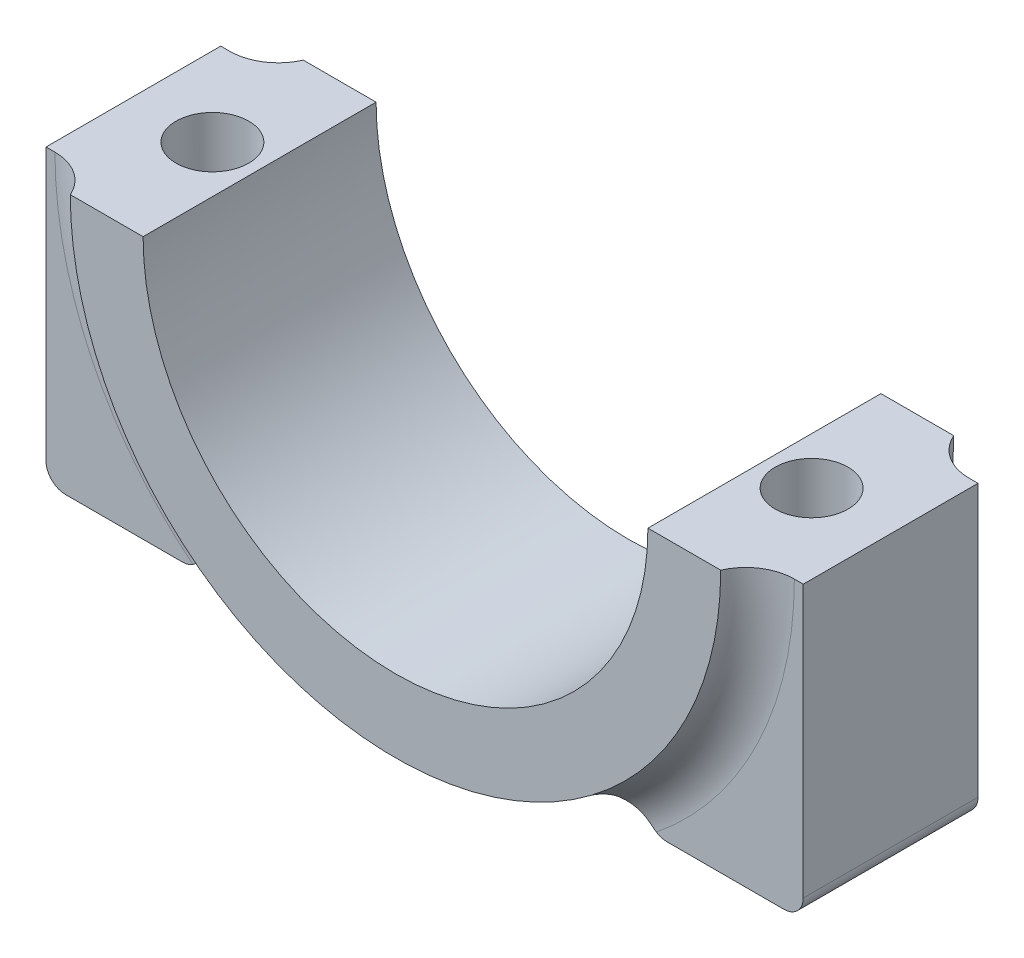
ISO-10303-21;
HEADER;
FILE_DESCRIPTION(('STEP AP214'),'2;1');
FILE_NAME('part.step','',(''),(''),'','','');
FILE_SCHEMA(('AUTOMOTIVE_DESIGN { 1 0 10303 214 1 1 1 1 }'));
ENDSEC;
DATA;
#1=APPLICATION_CONTEXT('core data for automotive mechanical design processes');
#2=APPLICATION_PROTOCOL_DEFINITION('international standard','automotive_design',2000,#1);
#3=PRODUCT_CONTEXT('',#1,'mechanical');
#4=PRODUCT('Part','Part','',(#3));
#5=PRODUCT_RELATED_PRODUCT_CATEGORY('part','',(#4));
#6=PRODUCT_DEFINITION_FORMATION('','',#4);
#7=PRODUCT_DEFINITION_CONTEXT('part definition',#1,'design');
#8=PRODUCT_DEFINITION('design','',#6,#7);
#9=PRODUCT_DEFINITION_SHAPE('','',#8);
#10=(LENGTH_UNIT() NAMED_UNIT(*) SI_UNIT(.MILLI.,.METRE.));
#11=(NAMED_UNIT(*) PLANE_ANGLE_UNIT() SI_UNIT($,.RADIAN.));
#12=(NAMED_UNIT(*) SI_UNIT($,.STERADIAN.) SOLID_ANGLE_UNIT());
#13=UNCERTAINTY_MEASURE_WITH_UNIT(LENGTH_MEASURE(1.E-05),#10,'distance_accuracy_value','');
#14=(GEOMETRIC_REPRESENTATION_CONTEXT(3) GLOBAL_UNCERTAINTY_ASSIGNED_CONTEXT((#13)) GLOBAL_UNIT_ASSIGNED_CONTEXT((#10,
#11,#12)) REPRESENTATION_CONTEXT('',''));
#15=CARTESIAN_POINT('',(0.,0.,0.));
#16=DIRECTION('',(0.,0.,1.));
#17=DIRECTION('',(1.,0.,0.));
#18=AXIS2_PLACEMENT_3D('',#15,#16,#17);
#19=CARTESIAN_POINT('',(0.,0.,9.));
#20=DIRECTION('',(0.,0.,1.));
#21=DIRECTION('',(1.,0.,0.));
#22=AXIS2_PLACEMENT_3D('',#19,#20,#21);
#23=PLANE('',#22);
#24=DIRECTION('',(1.,0.,0.));
#25=VECTOR('',#24,1.);
#26=CARTESIAN_POINT('',(0.,0.,9.));
#27=LINE('',#26,#25);
#28=CARTESIAN_POINT('',(38.0825756949558,0.,9.));
#29=VERTEX_POINT('',#28);
#30=CARTESIAN_POINT('',(39.,0.,9.));
#31=VERTEX_POINT('',#30);
#32=EDGE_CURVE('E418',#29,#31,#27,.T.);
#33=ORIENTED_EDGE('',*,*,#32,.F.);
#34=CARTESIAN_POINT('',(0.,0.,9.));
#35=DIRECTION('',(0.,0.,1.));
#36=DIRECTION('',(1.,0.,0.));
#37=AXIS2_PLACEMENT_3D('',#34,#35,#36);
#38=CIRCLE('',#37,38.0825756949558);
#39=CARTESIAN_POINT('',(23.8681162083472,-29.6748310901153,9.));
#40=VERTEX_POINT('',#39);
#41=EDGE_CURVE('E223',#29,#40,#38,.F.);
#42=ORIENTED_EDGE('',*,*,#41,.T.);
#43=CARTESIAN_POINT('',(24.9612496949732,-28.,9.));
#44=DIRECTION('',(0.,0.,1.));
#45=DIRECTION('',(1.,0.,0.));
#46=AXIS2_PLACEMENT_3D('',#43,#44,#45);
#47=CIRCLE('',#46,2.);
#48=CARTESIAN_POINT('',(24.9612496949732,-30.,9.));
#49=VERTEX_POINT('',#48);
#50=EDGE_CURVE('E472',#40,#49,#47,.T.);
#51=ORIENTED_EDGE('',*,*,#50,.T.);
#52=DIRECTION('',(1.,0.,0.));
#53=VECTOR('',#52,1.);
#54=CARTESIAN_POINT('',(0.,-30.,9.));
#55=LINE('',#54,#53);
#56=CARTESIAN_POINT('',(37.,-30.,9.));
#57=VERTEX_POINT('',#56);
#58=EDGE_CURVE('E410',#49,#57,#55,.T.);
#59=ORIENTED_EDGE('',*,*,#58,.T.);
#60=CARTESIAN_POINT('',(37.,-28.,9.));
#61=DIRECTION('',(0.,0.,1.));
#62=DIRECTION('',(1.,0.,0.));
#63=AXIS2_PLACEMENT_3D('',#60,#61,#62);
#64=CIRCLE('',#63,2.);
#65=CARTESIAN_POINT('',(39.,-28.,9.));
#66=VERTEX_POINT('',#65);
#67=EDGE_CURVE('E475',#57,#66,#64,.T.);
#68=ORIENTED_EDGE('',*,*,#67,.T.);
#69=DIRECTION('',(0.,-1.,0.));
#70=VECTOR('',#69,1.);
#71=CARTESIAN_POINT('',(39.,0.,9.));
#72=LINE('',#71,#70);
#73=EDGE_CURVE('E414',#31,#66,#72,.T.);
#74=ORIENTED_EDGE('',*,*,#73,.F.);
#75=EDGE_LOOP('',(#33,#42,#51,#59,#68,#74));
#76=FACE_BOUND('',#75,.T.);
#77=ADVANCED_FACE('F45',(#76),#23,.T.);
#78=CARTESIAN_POINT('',(-24.9612496949732,-28.,9.));
#79=DIRECTION('',(0.,0.,1.));
#80=DIRECTION('',(1.,0.,0.));
#81=AXIS2_PLACEMENT_3D('',#78,#79,#80);
#82=CIRCLE('',#81,2.);
#83=CARTESIAN_POINT('',(-24.9612496949732,-30.,9.));
#84=VERTEX_POINT('',#83);
#85=CARTESIAN_POINT('',(-23.8681162083472,-29.6748310901153,9.));
#86=VERTEX_POINT('',#85);
#87=EDGE_CURVE('E347',#84,#86,#82,.T.);
#88=ORIENTED_EDGE('',*,*,#87,.T.);
#89=CARTESIAN_POINT('',(0.,0.,9.));
#90=DIRECTION('',(0.,0.,1.));
#91=DIRECTION('',(1.,0.,0.));
#92=AXIS2_PLACEMENT_3D('',#89,#90,#91);
#93=CIRCLE('',#92,38.0825756949558);
#94=CARTESIAN_POINT('',(-38.0825756949558,0.,9.));
#95=VERTEX_POINT('',#94);
#96=EDGE_CURVE('E230',#86,#95,#93,.F.);
#97=ORIENTED_EDGE('',*,*,#96,.T.);
#98=DIRECTION('',(1.,0.,0.));
#99=VECTOR('',#98,1.);
#100=CARTESIAN_POINT('',(0.,0.,9.));
#101=LINE('',#100,#99);
#102=CARTESIAN_POINT('',(-39.,0.,9.));
#103=VERTEX_POINT('',#102);
#104=EDGE_CURVE('E373',#103,#95,#101,.T.);
#105=ORIENTED_EDGE('',*,*,#104,.F.);
#106=DIRECTION('',(0.,-1.,0.));
#107=VECTOR('',#106,1.);
#108=CARTESIAN_POINT('',(-39.,0.,9.));
#109=LINE('',#108,#107);
#110=CARTESIAN_POINT('',(-39.,-28.,9.));
#111=VERTEX_POINT('',#110);
#112=EDGE_CURVE('E403',#103,#111,#109,.T.);
#113=ORIENTED_EDGE('',*,*,#112,.T.);
#114=CARTESIAN_POINT('',(-37.,-28.,9.));
#115=DIRECTION('',(0.,0.,1.));
#116=DIRECTION('',(1.,0.,0.));
#117=AXIS2_PLACEMENT_3D('',#114,#115,#116);
#118=CIRCLE('',#117,2.);
#119=CARTESIAN_POINT('',(-37.,-30.,9.));
#120=VERTEX_POINT('',#119);
#121=EDGE_CURVE('E361',#111,#120,#118,.T.);
#122=ORIENTED_EDGE('',*,*,#121,.T.);
#123=DIRECTION('',(1.,0.,0.));
#124=VECTOR('',#123,1.);
#125=CARTESIAN_POINT('',(0.,-30.,9.));
#126=LINE('',#125,#124);
#127=EDGE_CURVE('E359',#120,#84,#126,.T.);
#128=ORIENTED_EDGE('',*,*,#127,.T.);
#129=EDGE_LOOP('',(#88,#97,#105,#113,#122,#128));
#130=FACE_BOUND('',#129,.T.);
#131=ADVANCED_FACE('F355',(#130),#23,.T.);
#132=CARTESIAN_POINT('',(0.,0.,-9.));
#133=DIRECTION('',(0.,0.,1.));
#134=DIRECTION('',(1.,0.,0.));
#135=AXIS2_PLACEMENT_3D('',#132,#133,#134);
#136=PLANE('',#135);
#137=CARTESIAN_POINT('',(24.9612496949732,-28.,-9.));
#138=DIRECTION('',(0.,0.,1.));
#139=DIRECTION('',(1.,0.,0.));
#140=AXIS2_PLACEMENT_3D('',#137,#138,#139);
#141=CIRCLE('',#140,2.);
#142=CARTESIAN_POINT('',(24.9612496949732,-30.,-9.));
#143=VERTEX_POINT('',#142);
#144=CARTESIAN_POINT('',(23.8681162083472,-29.6748310901153,-9.));
#145=VERTEX_POINT('',#144);
#146=EDGE_CURVE('E459',#143,#145,#141,.F.);
#147=ORIENTED_EDGE('',*,*,#146,.T.);
#148=CARTESIAN_POINT('',(0.,0.,-9.));
#149=DIRECTION('',(0.,0.,1.));
#150=DIRECTION('',(1.,0.,0.));
#151=AXIS2_PLACEMENT_3D('',#148,#149,#150);
#152=CIRCLE('',#151,38.0825756949558);
#153=CARTESIAN_POINT('',(38.0825756949558,0.,-9.));
#154=VERTEX_POINT('',#153);
#155=EDGE_CURVE('E307',#145,#154,#152,.T.);
#156=ORIENTED_EDGE('',*,*,#155,.T.);
#157=DIRECTION('',(1.,0.,0.));
#158=VECTOR('',#157,1.);
#159=CARTESIAN_POINT('',(0.,0.,-9.));
#160=LINE('',#159,#158);
#161=CARTESIAN_POINT('',(39.,0.,-9.));
#162=VERTEX_POINT('',#161);
#163=EDGE_CURVE('E404',#154,#162,#160,.T.);
#164=ORIENTED_EDGE('',*,*,#163,.T.);
#165=DIRECTION('',(0.,-1.,0.));
#166=VECTOR('',#165,1.);
#167=CARTESIAN_POINT('',(39.,0.,-9.));
#168=LINE('',#167,#166);
#169=CARTESIAN_POINT('',(39.,-28.,-9.));
#170=VERTEX_POINT('',#169);
#171=EDGE_CURVE('E432',#162,#170,#168,.T.);
#172=ORIENTED_EDGE('',*,*,#171,.T.);
#173=CARTESIAN_POINT('',(37.,-28.,-9.));
#174=DIRECTION('',(0.,0.,1.));
#175=DIRECTION('',(1.,0.,0.));
#176=AXIS2_PLACEMENT_3D('',#173,#174,#175);
#177=CIRCLE('',#176,2.);
#178=CARTESIAN_POINT('',(37.,-30.,-9.));
#179=VERTEX_POINT('',#178);
#180=EDGE_CURVE('E463',#170,#179,#177,.F.);
#181=ORIENTED_EDGE('',*,*,#180,.T.);
#182=DIRECTION('',(1.,0.,0.));
#183=VECTOR('',#182,1.);
#184=CARTESIAN_POINT('',(0.,-30.,-9.));
#185=LINE('',#184,#183);
#186=EDGE_CURVE('E428',#143,#179,#185,.T.);
#187=ORIENTED_EDGE('',*,*,#186,.F.);
#188=EDGE_LOOP('',(#147,#156,#164,#172,#181,#187));
#189=FACE_BOUND('',#188,.T.);
#190=ADVANCED_FACE('F575',(#189),#136,.F.);
#191=DIRECTION('',(1.,0.,0.));
#192=VECTOR('',#191,1.);
#193=CARTESIAN_POINT('',(0.,0.,-9.));
#194=LINE('',#193,#192);
#195=CARTESIAN_POINT('',(-39.,0.,-9.));
#196=VERTEX_POINT('',#195);
#197=CARTESIAN_POINT('',(-38.0825756949558,0.,-9.));
#198=VERTEX_POINT('',#197);
#199=EDGE_CURVE('E375',#196,#198,#194,.T.);
#200=ORIENTED_EDGE('',*,*,#199,.T.);
#201=CARTESIAN_POINT('',(0.,0.,-9.));
#202=DIRECTION('',(0.,0.,1.));
#203=DIRECTION('',(1.,0.,0.));
#204=AXIS2_PLACEMENT_3D('',#201,#202,#203);
#205=CIRCLE('',#204,38.0825756949558);
#206=CARTESIAN_POINT('',(-23.8681162083472,-29.6748310901153,-9.));
#207=VERTEX_POINT('',#206);
#208=EDGE_CURVE('E237',#198,#207,#205,.T.);
#209=ORIENTED_EDGE('',*,*,#208,.T.);
#210=CARTESIAN_POINT('',(-24.9612496949732,-28.,-9.));
#211=DIRECTION('',(0.,0.,1.));
#212=DIRECTION('',(1.,0.,0.));
#213=AXIS2_PLACEMENT_3D('',#210,#211,#212);
#214=CIRCLE('',#213,2.);
#215=CARTESIAN_POINT('',(-24.9612496949732,-30.,-9.));
#216=VERTEX_POINT('',#215);
#217=EDGE_CURVE('E487',#207,#216,#214,.F.);
#218=ORIENTED_EDGE('',*,*,#217,.T.);
#219=DIRECTION('',(1.,0.,0.));
#220=VECTOR('',#219,1.);
#221=CARTESIAN_POINT('',(0.,-30.,-9.));
#222=LINE('',#221,#220);
#223=CARTESIAN_POINT('',(-37.,-30.,-9.));
#224=VERTEX_POINT('',#223);
#225=EDGE_CURVE('E424',#224,#216,#222,.T.);
#226=ORIENTED_EDGE('',*,*,#225,.F.);
#227=CARTESIAN_POINT('',(-37.,-28.,-9.));
#228=DIRECTION('',(0.,0.,1.));
#229=DIRECTION('',(1.,0.,0.));
#230=AXIS2_PLACEMENT_3D('',#227,#228,#229);
#231=CIRCLE('',#230,2.);
#232=CARTESIAN_POINT('',(-39.,-28.,-9.));
#233=VERTEX_POINT('',#232);
#234=EDGE_CURVE('E490',#224,#233,#231,.F.);
#235=ORIENTED_EDGE('',*,*,#234,.T.);
#236=DIRECTION('',(0.,-1.,0.));
#237=VECTOR('',#236,1.);
#238=CARTESIAN_POINT('',(-39.,0.,-9.));
#239=LINE('',#238,#237);
#240=EDGE_CURVE('E380',#196,#233,#239,.T.);
#241=ORIENTED_EDGE('',*,*,#240,.F.);
#242=EDGE_LOOP('',(#200,#209,#218,#226,#235,#241));
#243=FACE_BOUND('',#242,.T.);
#244=ADVANCED_FACE('F510',(#243),#136,.F.);
#245=CARTESIAN_POINT('',(0.,0.,9.));
#246=DIRECTION('',(0.,0.,-1.));
#247=DIRECTION('',(-1.,0.,0.));
#248=AXIS2_PLACEMENT_3D('',#245,#246,#247);
#249=CYLINDRICAL_SURFACE('',#248,26.);
#250=DIRECTION('',(0.,0.,-1.));
#251=VECTOR('',#250,1.);
#252=CARTESIAN_POINT('',(26.,0.,9.));
#253=LINE('',#252,#251);
#254=CARTESIAN_POINT('',(26.,0.,12.));
#255=VERTEX_POINT('',#254);
#256=CARTESIAN_POINT('',(26.,0.,-12.));
#257=VERTEX_POINT('',#256);
#258=EDGE_CURVE('E217',#255,#257,#253,.T.);
#259=ORIENTED_EDGE('',*,*,#258,.T.);
#260=CARTESIAN_POINT('',(0.,0.,-12.));
#261=DIRECTION('',(0.,0.,1.));
#262=DIRECTION('',(1.,0.,0.));
#263=AXIS2_PLACEMENT_3D('',#260,#261,#262);
#264=CIRCLE('',#263,26.);
#265=CARTESIAN_POINT('',(-26.,0.,-12.));
#266=VERTEX_POINT('',#265);
#267=EDGE_CURVE('E394',#266,#257,#264,.T.);
#268=ORIENTED_EDGE('',*,*,#267,.F.);
#269=DIRECTION('',(0.,0.,-1.));
#270=VECTOR('',#269,1.);
#271=CARTESIAN_POINT('',(-26.,0.,9.));
#272=LINE('',#271,#270);
#273=CARTESIAN_POINT('',(-26.,0.,12.));
#274=VERTEX_POINT('',#273);
#275=EDGE_CURVE('E447',#274,#266,#272,.T.);
#276=ORIENTED_EDGE('',*,*,#275,.F.);
#277=CARTESIAN_POINT('',(0.,0.,12.));
#278=DIRECTION('',(0.,0.,1.));
#279=DIRECTION('',(1.,0.,0.));
#280=AXIS2_PLACEMENT_3D('',#277,#278,#279);
#281=CIRCLE('',#280,26.);
#282=EDGE_CURVE('E219',#274,#255,#281,.T.);
#283=ORIENTED_EDGE('',*,*,#282,.T.);
#284=EDGE_LOOP('',(#259,#268,#276,#283));
#285=FACE_BOUND('',#284,.T.);
#286=ADVANCED_FACE('F568',(#285),#249,.F.);
#287=CARTESIAN_POINT('',(0.,0.,9.));
#288=DIRECTION('',(0.,1.,0.));
#289=DIRECTION('',(-1.,0.,0.));
#290=AXIS2_PLACEMENT_3D('',#287,#288,#289);
#291=PLANE('',#290);
#292=CARTESIAN_POINT('',(-30.86,0.,0.));
#293=DIRECTION('',(0.,-1.,0.));
#294=DIRECTION('',(1.,0.,0.));
#295=AXIS2_PLACEMENT_3D('',#292,#293,#294);
#296=CIRCLE('',#295,3.75);
#297=CARTESIAN_POINT('',(-27.11,0.,0.));
#298=VERTEX_POINT('',#297);
#299=EDGE_CURVE('E532',#298,#298,#296,.T.);
#300=ORIENTED_EDGE('',*,*,#299,.T.);
#301=EDGE_LOOP('',(#300));
#302=FACE_BOUND('',#301,.T.);
#303=DIRECTION('',(1.,0.,0.));
#304=VECTOR('',#303,1.);
#305=CARTESIAN_POINT('',(0.,0.,-12.));
#306=LINE('',#305,#304);
#307=CARTESIAN_POINT('',(-33.5,0.,-12.));
#308=VERTEX_POINT('',#307);
#309=EDGE_CURVE('E210',#308,#266,#306,.T.);
#310=ORIENTED_EDGE('',*,*,#309,.F.);
#311=CARTESIAN_POINT('',(-38.0825756949558,0.,-14.));
#312=DIRECTION('',(0.,1.,0.));
#313=DIRECTION('',(-1.,0.,0.));
#314=AXIS2_PLACEMENT_3D('',#311,#312,#313);
#315=CIRCLE('',#314,5.);
#316=EDGE_CURVE('E317',#308,#198,#315,.F.);
#317=ORIENTED_EDGE('',*,*,#316,.T.);
#318=ORIENTED_EDGE('',*,*,#199,.F.);
#319=DIRECTION('',(0.,0.,-1.));
#320=VECTOR('',#319,1.);
#321=CARTESIAN_POINT('',(-39.,0.,9.));
#322=LINE('',#321,#320);
#323=EDGE_CURVE('E444',#103,#196,#322,.T.);
#324=ORIENTED_EDGE('',*,*,#323,.F.);
#325=ORIENTED_EDGE('',*,*,#104,.T.);
#326=CARTESIAN_POINT('',(-38.0825756949558,0.,14.));
#327=DIRECTION('',(0.,1.,0.));
#328=DIRECTION('',(-1.,0.,0.));
#329=AXIS2_PLACEMENT_3D('',#326,#327,#328);
#330=CIRCLE('',#329,5.);
#331=CARTESIAN_POINT('',(-33.5,0.,12.));
#332=VERTEX_POINT('',#331);
#333=EDGE_CURVE('E330',#95,#332,#330,.F.);
#334=ORIENTED_EDGE('',*,*,#333,.T.);
#335=DIRECTION('',(1.,0.,0.));
#336=VECTOR('',#335,1.);
#337=CARTESIAN_POINT('',(0.,0.,12.));
#338=LINE('',#337,#336);
#339=EDGE_CURVE('E372',#332,#274,#338,.T.);
#340=ORIENTED_EDGE('',*,*,#339,.T.);
#341=ORIENTED_EDGE('',*,*,#275,.T.);
#342=EDGE_LOOP('',(#310,#317,#318,#324,#325,#334,#340,#341));
#343=FACE_BOUND('',#342,.T.);
#344=ADVANCED_FACE('F371',(#302,#343),#291,.T.);
#345=CARTESIAN_POINT('',(-39.,0.,9.));
#346=DIRECTION('',(1.,0.,0.));
#347=DIRECTION('',(0.,1.,0.));
#348=AXIS2_PLACEMENT_3D('',#345,#346,#347);
#349=PLANE('',#348);
#350=ORIENTED_EDGE('',*,*,#240,.T.);
#351=DIRECTION('',(0.,0.,-1.));
#352=VECTOR('',#351,1.);
#353=CARTESIAN_POINT('',(-39.,-28.,9.));
#354=LINE('',#353,#352);
#355=EDGE_CURVE('E362',#233,#111,#354,.F.);
#356=ORIENTED_EDGE('',*,*,#355,.T.);
#357=ORIENTED_EDGE('',*,*,#112,.F.);
#358=ORIENTED_EDGE('',*,*,#323,.T.);
#359=EDGE_LOOP('',(#350,#356,#357,#358));
#360=FACE_BOUND('',#359,.T.);
#361=ADVANCED_FACE('F552',(#360),#349,.F.);
#362=CARTESIAN_POINT('',(0.,-30.,9.));
#363=DIRECTION('',(0.,1.,0.));
#364=DIRECTION('',(-1.,0.,0.));
#365=AXIS2_PLACEMENT_3D('',#362,#363,#364);
#366=PLANE('',#365);
#367=CARTESIAN_POINT('',(-30.86,-30.,0.));
#368=DIRECTION('',(0.,1.,0.));
#369=DIRECTION('',(-1.,0.,0.));
#370=AXIS2_PLACEMENT_3D('',#367,#368,#369);
#371=CIRCLE('',#370,3.75);
#372=CARTESIAN_POINT('',(-34.61,-30.,0.));
#373=VERTEX_POINT('',#372);
#374=EDGE_CURVE('E451',#373,#373,#371,.T.);
#375=ORIENTED_EDGE('',*,*,#374,.T.);
#376=EDGE_LOOP('',(#375));
#377=FACE_BOUND('',#376,.T.);
#378=ORIENTED_EDGE('',*,*,#127,.F.);
#379=DIRECTION('',(0.,0.,-1.));
#380=VECTOR('',#379,1.);
#381=CARTESIAN_POINT('',(-37.,-30.,9.));
#382=LINE('',#381,#380);
#383=EDGE_CURVE('E483',#120,#224,#382,.T.);
#384=ORIENTED_EDGE('',*,*,#383,.T.);
#385=ORIENTED_EDGE('',*,*,#225,.T.);
#386=DIRECTION('',(0.,0.,1.));
#387=VECTOR('',#386,1.);
#388=CARTESIAN_POINT('',(-24.9612496949732,-30.,9.));
#389=LINE('',#388,#387);
#390=EDGE_CURVE('E480',#216,#84,#389,.T.);
#391=ORIENTED_EDGE('',*,*,#390,.T.);
#392=EDGE_LOOP('',(#378,#384,#385,#391));
#393=FACE_BOUND('',#392,.T.);
#394=ADVANCED_FACE('F549',(#377,#393),#366,.F.);
#395=CARTESIAN_POINT('',(0.,0.,9.));
#396=DIRECTION('',(0.,0.,-1.));
#397=DIRECTION('',(-1.,0.,0.));
#398=AXIS2_PLACEMENT_3D('',#395,#396,#397);
#399=CYLINDRICAL_SURFACE('',#398,33.5);
#400=CARTESIAN_POINT('',(0.,0.,-12.));
#401=DIRECTION('',(0.,0.,1.));
#402=DIRECTION('',(1.,0.,0.));
#403=AXIS2_PLACEMENT_3D('',#400,#401,#402);
#404=CIRCLE('',#403,33.5);
#405=CARTESIAN_POINT('',(-20.1602561852669,-26.7547018399459,-12.));
#406=VERTEX_POINT('',#405);
#407=CARTESIAN_POINT('',(20.1602561852669,-26.7547018399459,-12.));
#408=VERTEX_POINT('',#407);
#409=EDGE_CURVE('E389',#406,#408,#404,.T.);
#410=ORIENTED_EDGE('',*,*,#409,.T.);
#411=DIRECTION('',(0.,0.,-1.));
#412=VECTOR('',#411,1.);
#413=CARTESIAN_POINT('',(20.1602561852669,-26.7547018399459,9.));
#414=LINE('',#413,#412);
#415=CARTESIAN_POINT('',(20.1602561852669,-26.7547018399459,12.));
#416=VERTEX_POINT('',#415);
#417=EDGE_CURVE('E301',#408,#416,#414,.F.);
#418=ORIENTED_EDGE('',*,*,#417,.T.);
#419=CARTESIAN_POINT('',(0.,0.,12.));
#420=DIRECTION('',(0.,0.,1.));
#421=DIRECTION('',(1.,0.,0.));
#422=AXIS2_PLACEMENT_3D('',#419,#420,#421);
#423=CIRCLE('',#422,33.5);
#424=CARTESIAN_POINT('',(-20.1602561852669,-26.7547018399459,12.));
#425=VERTEX_POINT('',#424);
#426=EDGE_CURVE('E205',#425,#416,#423,.T.);
#427=ORIENTED_EDGE('',*,*,#426,.F.);
#428=DIRECTION('',(0.,0.,-1.));
#429=VECTOR('',#428,1.);
#430=CARTESIAN_POINT('',(-20.1602561852669,-26.7547018399459,9.));
#431=LINE('',#430,#429);
#432=EDGE_CURVE('E308',#425,#406,#431,.T.);
#433=ORIENTED_EDGE('',*,*,#432,.T.);
#434=EDGE_LOOP('',(#410,#418,#427,#433));
#435=FACE_BOUND('',#434,.T.);
#436=ADVANCED_FACE('F525',(#435),#399,.T.);
#437=CARTESIAN_POINT('',(0.,-30.,9.));
#438=DIRECTION('',(0.,1.,0.));
#439=DIRECTION('',(-1.,0.,0.));
#440=AXIS2_PLACEMENT_3D('',#437,#438,#439);
#441=PLANE('',#440);
#442=CARTESIAN_POINT('',(30.86,-30.,0.));
#443=DIRECTION('',(0.,1.,0.));
#444=DIRECTION('',(-1.,0.,0.));
#445=AXIS2_PLACEMENT_3D('',#442,#443,#444);
#446=CIRCLE('',#445,3.75);
#447=CARTESIAN_POINT('',(27.11,-30.,0.));
#448=VERTEX_POINT('',#447);
#449=EDGE_CURVE('E455',#448,#448,#446,.T.);
#450=ORIENTED_EDGE('',*,*,#449,.T.);
#451=EDGE_LOOP('',(#450));
#452=FACE_BOUND('',#451,.T.);
#453=ORIENTED_EDGE('',*,*,#186,.T.);
#454=DIRECTION('',(0.,0.,-1.));
#455=VECTOR('',#454,1.);
#456=CARTESIAN_POINT('',(37.,-30.,9.));
#457=LINE('',#456,#455);
#458=EDGE_CURVE('E469',#179,#57,#457,.F.);
#459=ORIENTED_EDGE('',*,*,#458,.T.);
#460=ORIENTED_EDGE('',*,*,#58,.F.);
#461=DIRECTION('',(0.,0.,1.));
#462=VECTOR('',#461,1.);
#463=CARTESIAN_POINT('',(24.9612496949732,-30.,9.));
#464=LINE('',#463,#462);
#465=EDGE_CURVE('E466',#49,#143,#464,.F.);
#466=ORIENTED_EDGE('',*,*,#465,.T.);
#467=EDGE_LOOP('',(#453,#459,#460,#466));
#468=FACE_BOUND('',#467,.T.);
#469=ADVANCED_FACE('F593',(#452,#468),#441,.F.);
#470=CARTESIAN_POINT('',(39.,0.,9.));
#471=DIRECTION('',(1.,0.,0.));
#472=DIRECTION('',(0.,1.,0.));
#473=AXIS2_PLACEMENT_3D('',#470,#471,#472);
#474=PLANE('',#473);
#475=ORIENTED_EDGE('',*,*,#73,.T.);
#476=DIRECTION('',(0.,0.,-1.));
#477=VECTOR('',#476,1.);
#478=CARTESIAN_POINT('',(39.,-28.,-9.));
#479=LINE('',#478,#477);
#480=EDGE_CURVE('E450',#66,#170,#479,.T.);
#481=ORIENTED_EDGE('',*,*,#480,.T.);
#482=ORIENTED_EDGE('',*,*,#171,.F.);
#483=DIRECTION('',(0.,0.,-1.));
#484=VECTOR('',#483,1.);
#485=CARTESIAN_POINT('',(39.,0.,9.));
#486=LINE('',#485,#484);
#487=EDGE_CURVE('E440',#31,#162,#486,.T.);
#488=ORIENTED_EDGE('',*,*,#487,.F.);
#489=EDGE_LOOP('',(#475,#481,#482,#488));
#490=FACE_BOUND('',#489,.T.);
#491=ADVANCED_FACE('F589',(#490),#474,.T.);
#492=CARTESIAN_POINT('',(0.,0.,9.));
#493=DIRECTION('',(0.,1.,0.));
#494=DIRECTION('',(-1.,0.,0.));
#495=AXIS2_PLACEMENT_3D('',#492,#493,#494);
#496=PLANE('',#495);
#497=CARTESIAN_POINT('',(30.86,0.,0.));
#498=DIRECTION('',(0.,-1.,0.));
#499=DIRECTION('',(-1.,0.,0.));
#500=AXIS2_PLACEMENT_3D('',#497,#498,#499);
#501=CIRCLE('',#500,3.75);
#502=CARTESIAN_POINT('',(27.11,0.,0.));
#503=VERTEX_POINT('',#502);
#504=EDGE_CURVE('E533',#503,#503,#501,.T.);
#505=ORIENTED_EDGE('',*,*,#504,.T.);
#506=EDGE_LOOP('',(#505));
#507=FACE_BOUND('',#506,.T.);
#508=DIRECTION('',(1.,0.,0.));
#509=VECTOR('',#508,1.);
#510=CARTESIAN_POINT('',(0.,0.,12.));
#511=LINE('',#510,#509);
#512=CARTESIAN_POINT('',(33.5,0.,12.));
#513=VERTEX_POINT('',#512);
#514=EDGE_CURVE('E202',#255,#513,#511,.T.);
#515=ORIENTED_EDGE('',*,*,#514,.T.);
#516=CARTESIAN_POINT('',(38.0825756949558,0.,14.));
#517=DIRECTION('',(0.,1.,0.));
#518=DIRECTION('',(-1.,0.,0.));
#519=AXIS2_PLACEMENT_3D('',#516,#517,#518);
#520=CIRCLE('',#519,5.);
#521=EDGE_CURVE('E11',#513,#29,#520,.F.);
#522=ORIENTED_EDGE('',*,*,#521,.T.);
#523=ORIENTED_EDGE('',*,*,#32,.T.);
#524=ORIENTED_EDGE('',*,*,#487,.T.);
#525=ORIENTED_EDGE('',*,*,#163,.F.);
#526=CARTESIAN_POINT('',(38.0825756949558,0.,-14.));
#527=DIRECTION('',(0.,1.,0.));
#528=DIRECTION('',(-1.,0.,0.));
#529=AXIS2_PLACEMENT_3D('',#526,#527,#528);
#530=CIRCLE('',#529,5.);
#531=CARTESIAN_POINT('',(33.5,0.,-12.));
#532=VERTEX_POINT('',#531);
#533=EDGE_CURVE('E267',#154,#532,#530,.F.);
#534=ORIENTED_EDGE('',*,*,#533,.T.);
#535=DIRECTION('',(1.,0.,0.));
#536=VECTOR('',#535,1.);
#537=CARTESIAN_POINT('',(0.,0.,-12.));
#538=LINE('',#537,#536);
#539=EDGE_CURVE('E388',#257,#532,#538,.T.);
#540=ORIENTED_EDGE('',*,*,#539,.F.);
#541=ORIENTED_EDGE('',*,*,#258,.F.);
#542=EDGE_LOOP('',(#515,#522,#523,#524,#525,#534,#540,#541));
#543=FACE_BOUND('',#542,.T.);
#544=ADVANCED_FACE('F214',(#507,#543),#496,.T.);
#545=CARTESIAN_POINT('',(0.,0.,-12.));
#546=DIRECTION('',(0.,0.,1.));
#547=DIRECTION('',(1.,0.,0.));
#548=AXIS2_PLACEMENT_3D('',#545,#546,#547);
#549=PLANE('',#548);
#550=EDGE_CURVE('E384',#308,#406,#404,.T.);
#551=ORIENTED_EDGE('',*,*,#550,.F.);
#552=ORIENTED_EDGE('',*,*,#309,.T.);
#553=ORIENTED_EDGE('',*,*,#267,.T.);
#554=ORIENTED_EDGE('',*,*,#539,.T.);
#555=EDGE_CURVE('E390',#408,#532,#404,.T.);
#556=ORIENTED_EDGE('',*,*,#555,.F.);
#557=ORIENTED_EDGE('',*,*,#409,.F.);
#558=EDGE_LOOP('',(#551,#552,#553,#554,#556,#557));
#559=FACE_BOUND('',#558,.T.);
#560=ADVANCED_FACE('F562',(#559),#549,.F.);
#561=CARTESIAN_POINT('',(0.,0.,12.));
#562=DIRECTION('',(0.,0.,1.));
#563=DIRECTION('',(1.,0.,0.));
#564=AXIS2_PLACEMENT_3D('',#561,#562,#563);
#565=PLANE('',#564);
#566=EDGE_CURVE('E212',#332,#425,#423,.T.);
#567=ORIENTED_EDGE('',*,*,#566,.T.);
#568=ORIENTED_EDGE('',*,*,#426,.T.);
#569=EDGE_CURVE('E197',#416,#513,#423,.T.);
#570=ORIENTED_EDGE('',*,*,#569,.T.);
#571=ORIENTED_EDGE('',*,*,#514,.F.);
#572=ORIENTED_EDGE('',*,*,#282,.F.);
#573=ORIENTED_EDGE('',*,*,#339,.F.);
#574=EDGE_LOOP('',(#567,#568,#570,#571,#572,#573));
#575=FACE_BOUND('',#574,.T.);
#576=ADVANCED_FACE('F200',(#575),#565,.T.);
#577=CARTESIAN_POINT('',(24.,-30.,-12.));
#578=DIRECTION('',(0.780868809443031,0.624695047554424,0.));
#579=DIRECTION('',(-0.624695047554424,0.780868809443031,0.));
#580=AXIS2_PLACEMENT_3D('',#577,#578,#579);
#581=PLANE('',#580);
#582=DIRECTION('',(0.,0.,1.));
#583=VECTOR('',#582,1.);
#584=CARTESIAN_POINT('',(23.3995120760871,-29.2493900951088,-12.));
#585=LINE('',#584,#583);
#586=CARTESIAN_POINT('',(23.3995120760871,-29.2493900951088,-9.03922636709346));
#587=VERTEX_POINT('',#586);
#588=CARTESIAN_POINT('',(23.3995120760871,-29.2493900951088,9.03922636709346));
#589=VERTEX_POINT('',#588);
#590=EDGE_CURVE('E69',#587,#589,#585,.T.);
#591=ORIENTED_EDGE('',*,*,#590,.T.);
#592=CARTESIAN_POINT('',(23.7899964347554,-29.7374955434443,14.));
#593=DIRECTION('',(0.780868809443031,0.624695047554424,0.));
#594=DIRECTION('',(-0.624695047554424,0.780868809443031,0.));
#595=AXIS2_PLACEMENT_3D('',#592,#593,#594);
#596=CIRCLE('',#595,5.);
#597=CARTESIAN_POINT('',(21.5429236868075,-26.9286546085093,10.5270939160894));
#598=VERTEX_POINT('',#597);
#599=EDGE_CURVE('E288',#589,#598,#596,.T.);
#600=ORIENTED_EDGE('',*,*,#599,.T.);
#601=DIRECTION('',(0.,0.,1.));
#602=VECTOR('',#601,1.);
#603=CARTESIAN_POINT('',(21.5429236868075,-26.9286546085093,-9.));
#604=LINE('',#603,#602);
#605=CARTESIAN_POINT('',(21.5429236868075,-26.9286546085093,-10.5270939160894));
#606=VERTEX_POINT('',#605);
#607=EDGE_CURVE('E62',#598,#606,#604,.F.);
#608=ORIENTED_EDGE('',*,*,#607,.T.);
#609=CARTESIAN_POINT('',(23.7899964347554,-29.7374955434443,-14.));
#610=DIRECTION('',(0.780868809443031,0.624695047554424,0.));
#611=DIRECTION('',(-0.624695047554424,0.780868809443031,0.));
#612=AXIS2_PLACEMENT_3D('',#609,#610,#611);
#613=CIRCLE('',#612,5.);
#614=EDGE_CURVE('E234',#606,#587,#613,.T.);
#615=ORIENTED_EDGE('',*,*,#614,.T.);
#616=EDGE_LOOP('',(#591,#600,#608,#615));
#617=FACE_BOUND('',#616,.T.);
#618=ADVANCED_FACE('F303',(#617),#581,.F.);
#619=CARTESIAN_POINT('',(-24.,-30.,-12.));
#620=DIRECTION('',(-0.78086880944303,0.624695047554425,0.));
#621=DIRECTION('',(-0.624695047554425,-0.78086880944303,0.));
#622=AXIS2_PLACEMENT_3D('',#619,#620,#621);
#623=PLANE('',#622);
#624=DIRECTION('',(0.,0.,1.));
#625=VECTOR('',#624,1.);
#626=CARTESIAN_POINT('',(-23.3995120760871,-29.2493900951088,-12.));
#627=LINE('',#626,#625);
#628=CARTESIAN_POINT('',(-23.3995120760871,-29.2493900951088,9.03922636709346));
#629=VERTEX_POINT('',#628);
#630=CARTESIAN_POINT('',(-23.3995120760871,-29.2493900951088,-9.03922636709346));
#631=VERTEX_POINT('',#630);
#632=EDGE_CURVE('E349',#629,#631,#627,.F.);
#633=ORIENTED_EDGE('',*,*,#632,.T.);
#634=CARTESIAN_POINT('',(-23.7899964347554,-29.7374955434442,-14.));
#635=DIRECTION('',(-0.78086880944303,0.624695047554425,0.));
#636=DIRECTION('',(-0.624695047554425,-0.78086880944303,0.));
#637=AXIS2_PLACEMENT_3D('',#634,#635,#636);
#638=CIRCLE('',#637,5.);
#639=CARTESIAN_POINT('',(-21.5429236868075,-26.9286546085093,-10.5270939160894));
#640=VERTEX_POINT('',#639);
#641=EDGE_CURVE('E322',#631,#640,#638,.T.);
#642=ORIENTED_EDGE('',*,*,#641,.T.);
#643=DIRECTION('',(0.,0.,1.));
#644=VECTOR('',#643,1.);
#645=CARTESIAN_POINT('',(-21.5429236868075,-26.9286546085093,9.));
#646=LINE('',#645,#644);
#647=CARTESIAN_POINT('',(-21.5429236868075,-26.9286546085093,10.5270939160894));
#648=VERTEX_POINT('',#647);
#649=EDGE_CURVE('E499',#640,#648,#646,.T.);
#650=ORIENTED_EDGE('',*,*,#649,.T.);
#651=CARTESIAN_POINT('',(-23.7899964347554,-29.7374955434442,14.));
#652=DIRECTION('',(-0.78086880944303,0.624695047554425,0.));
#653=DIRECTION('',(-0.624695047554425,-0.78086880944303,0.));
#654=AXIS2_PLACEMENT_3D('',#651,#652,#653);
#655=CIRCLE('',#654,5.);
#656=EDGE_CURVE('E337',#648,#629,#655,.T.);
#657=ORIENTED_EDGE('',*,*,#656,.T.);
#658=EDGE_LOOP('',(#633,#642,#650,#657));
#659=FACE_BOUND('',#658,.T.);
#660=ADVANCED_FACE('F519',(#659),#623,.F.);
#661=CARTESIAN_POINT('',(30.86,0.,0.));
#662=DIRECTION('',(0.,-1.,0.));
#663=DIRECTION('',(1.,0.,0.));
#664=AXIS2_PLACEMENT_3D('',#661,#662,#663);
#665=CYLINDRICAL_SURFACE('',#664,3.75);
#666=ORIENTED_EDGE('',*,*,#504,.F.);
#667=EDGE_LOOP('',(#666));
#668=FACE_BOUND('',#667,.T.);
#669=ORIENTED_EDGE('',*,*,#449,.F.);
#670=EDGE_LOOP('',(#669));
#671=FACE_BOUND('',#670,.T.);
#672=ADVANCED_FACE('F545',(#668,#671),#665,.F.);
#673=CARTESIAN_POINT('',(-30.86,0.,0.));
#674=DIRECTION('',(0.,-1.,0.));
#675=DIRECTION('',(1.,0.,0.));
#676=AXIS2_PLACEMENT_3D('',#673,#674,#675);
#677=CYLINDRICAL_SURFACE('',#676,3.75);
#678=ORIENTED_EDGE('',*,*,#299,.F.);
#679=EDGE_LOOP('',(#678));
#680=FACE_BOUND('',#679,.T.);
#681=ORIENTED_EDGE('',*,*,#374,.F.);
#682=EDGE_LOOP('',(#681));
#683=FACE_BOUND('',#682,.T.);
#684=ADVANCED_FACE('F542',(#680,#683),#677,.F.);
#685=CARTESIAN_POINT('',(37.,-28.,9.));
#686=DIRECTION('',(0.,0.,1.));
#687=DIRECTION('',(1.,0.,0.));
#688=AXIS2_PLACEMENT_3D('',#685,#686,#687);
#689=CYLINDRICAL_SURFACE('',#688,2.);
#690=ORIENTED_EDGE('',*,*,#67,.F.);
#691=ORIENTED_EDGE('',*,*,#458,.F.);
#692=ORIENTED_EDGE('',*,*,#180,.F.);
#693=ORIENTED_EDGE('',*,*,#480,.F.);
#694=EDGE_LOOP('',(#690,#691,#692,#693));
#695=FACE_BOUND('',#694,.T.);
#696=ADVANCED_FACE('F275',(#695),#689,.T.);
#697=CARTESIAN_POINT('',(24.9612496949732,-28.,-12.));
#698=DIRECTION('',(0.,0.,1.));
#699=DIRECTION('',(1.,0.,0.));
#700=AXIS2_PLACEMENT_3D('',#697,#698,#699);
#701=CYLINDRICAL_SURFACE('',#700,2.);
#702=ORIENTED_EDGE('',*,*,#146,.F.);
#703=ORIENTED_EDGE('',*,*,#465,.F.);
#704=ORIENTED_EDGE('',*,*,#50,.F.);
#705=CARTESIAN_POINT('',(23.8681162083472,-29.6748310901153,9.));
#706=CARTESIAN_POINT('',(23.8234826941747,-29.6457083438386,8.99999343899627));
#707=CARTESIAN_POINT('',(23.7800206049355,-29.6147888390061,9.00077014115909));
#708=CARTESIAN_POINT('',(23.6960417671645,-29.5498511361259,9.00394907328253));
#709=CARTESIAN_POINT('',(23.6555059973794,-29.5158569553257,9.0063395112568));
#710=CARTESIAN_POINT('',(23.5773285379123,-29.4448360327491,9.01280287750187));
#711=CARTESIAN_POINT('',(23.5396868472838,-29.4078092919645,9.01687580522239));
#712=CARTESIAN_POINT('',(23.4672796772306,-29.3307429468586,9.02674636169299));
#713=CARTESIAN_POINT('',(23.4325371373676,-29.2906833670628,9.03255633322615));
#714=CARTESIAN_POINT('',(23.3995120760871,-29.2493900951088,9.03922636709346));
#715=B_SPLINE_CURVE_WITH_KNOTS('',3,(#705,#706,#707,#708,#709,#710,#711,#712,#713,#714),
.UNSPECIFIED.,.F.,.F.,(4,2,2,2,4),(0.,0.159835771160433,0.318516044937046,0.477196266816186,
0.637031949236423),.UNSPECIFIED.);
#716=EDGE_CURVE('E225',#40,#589,#715,.T.);
#717=ORIENTED_EDGE('',*,*,#716,.T.);
#718=ORIENTED_EDGE('',*,*,#590,.F.);
#719=CARTESIAN_POINT('',(23.3995120760871,-29.2493900951088,-9.03922636709346));
#720=CARTESIAN_POINT('',(23.4325371373676,-29.2906833670628,-9.03255633322615));
#721=CARTESIAN_POINT('',(23.4672796772306,-29.3307429468586,-9.02674636169299));
#722=CARTESIAN_POINT('',(23.5396868472838,-29.4078092919645,-9.01687580522239));
#723=CARTESIAN_POINT('',(23.5773285379123,-29.4448360327491,-9.01280287750187));
#724=CARTESIAN_POINT('',(23.6555059973794,-29.5158569553257,-9.0063395112568));
#725=CARTESIAN_POINT('',(23.6960417671645,-29.5498511361259,-9.00394907328253));
#726=CARTESIAN_POINT('',(23.7800206049355,-29.6147888390061,-9.00077014115909));
#727=CARTESIAN_POINT('',(23.8234826941747,-29.6457083438386,-8.99999343899627));
#728=CARTESIAN_POINT('',(23.8681162083472,-29.6748310901153,-9.));
#729=B_SPLINE_CURVE_WITH_KNOTS('',3,(#719,#720,#721,#722,#723,#724,#725,#726,#727,#728),
.UNSPECIFIED.,.F.,.F.,(4,2,2,2,4),(0.,0.159835682420235,0.318515904299374,0.477196178075985,
0.637031949236417),.UNSPECIFIED.);
#730=EDGE_CURVE('E259',#587,#145,#729,.T.);
#731=ORIENTED_EDGE('',*,*,#730,.T.);
#732=EDGE_LOOP('',(#702,#703,#704,#717,#718,#731));
#733=FACE_BOUND('',#732,.T.);
#734=ADVANCED_FACE('F269',(#733),#701,.T.);
#735=CARTESIAN_POINT('',(-37.,-28.,9.));
#736=DIRECTION('',(0.,0.,-1.));
#737=DIRECTION('',(-1.,0.,0.));
#738=AXIS2_PLACEMENT_3D('',#735,#736,#737);
#739=CYLINDRICAL_SURFACE('',#738,2.);
#740=ORIENTED_EDGE('',*,*,#121,.F.);
#741=ORIENTED_EDGE('',*,*,#355,.F.);
#742=ORIENTED_EDGE('',*,*,#234,.F.);
#743=ORIENTED_EDGE('',*,*,#383,.F.);
#744=EDGE_LOOP('',(#740,#741,#742,#743));
#745=FACE_BOUND('',#744,.T.);
#746=ADVANCED_FACE('F274',(#745),#739,.T.);
#747=CARTESIAN_POINT('',(-24.9612496949732,-28.,9.));
#748=DIRECTION('',(0.,0.,1.));
#749=DIRECTION('',(1.,0.,0.));
#750=AXIS2_PLACEMENT_3D('',#747,#748,#749);
#751=CYLINDRICAL_SURFACE('',#750,2.);
#752=ORIENTED_EDGE('',*,*,#217,.F.);
#753=CARTESIAN_POINT('',(-23.8681162083472,-29.6748310901153,-9.));
#754=CARTESIAN_POINT('',(-23.8234826941747,-29.6457083438386,-8.99999343899627));
#755=CARTESIAN_POINT('',(-23.7800206049355,-29.6147888390061,-9.00077014115909));
#756=CARTESIAN_POINT('',(-23.6960417671645,-29.5498511361259,-9.00394907328253));
#757=CARTESIAN_POINT('',(-23.6555059973794,-29.5158569553257,-9.0063395112568));
#758=CARTESIAN_POINT('',(-23.5773285379123,-29.4448360327491,-9.01280287750187));
#759=CARTESIAN_POINT('',(-23.5396868472838,-29.4078092919645,-9.01687580522239));
#760=CARTESIAN_POINT('',(-23.4672796772306,-29.3307429468586,-9.02674636169299));
#761=CARTESIAN_POINT('',(-23.4325371373676,-29.2906833670628,-9.03255633322616));
#762=CARTESIAN_POINT('',(-23.3995120760871,-29.2493900951088,-9.03922636709346));
#763=B_SPLINE_CURVE_WITH_KNOTS('',3,(#753,#754,#755,#756,#757,#758,#759,#760,#761,#762),
.UNSPECIFIED.,.F.,.F.,(4,2,2,2,4),(0.,0.15983577116044,0.318516044937061,0.4771962668162,
0.637031949236442),.UNSPECIFIED.);
#764=EDGE_CURVE('E319',#207,#631,#763,.T.);
#765=ORIENTED_EDGE('',*,*,#764,.T.);
#766=ORIENTED_EDGE('',*,*,#632,.F.);
#767=CARTESIAN_POINT('',(-23.3995120760871,-29.2493900951088,9.03922636709346));
#768=CARTESIAN_POINT('',(-23.4325371373676,-29.2906833670628,9.03255633322616));
#769=CARTESIAN_POINT('',(-23.4672796772306,-29.3307429468586,9.02674636169299));
#770=CARTESIAN_POINT('',(-23.5396868472838,-29.4078092919645,9.01687580522239));
#771=CARTESIAN_POINT('',(-23.5773285379123,-29.4448360327491,9.01280287750187));
#772=CARTESIAN_POINT('',(-23.6555059973794,-29.5158569553257,9.0063395112568));
#773=CARTESIAN_POINT('',(-23.6960417671645,-29.5498511361259,9.00394907328253));
#774=CARTESIAN_POINT('',(-23.7800206049355,-29.6147888390061,9.00077014115909));
#775=CARTESIAN_POINT('',(-23.8234826941747,-29.6457083438386,8.99999343899627));
#776=CARTESIAN_POINT('',(-23.8681162083472,-29.6748310901153,9.));
#777=B_SPLINE_CURVE_WITH_KNOTS('',3,(#767,#768,#769,#770,#771,#772,#773,#774,#775,#776),
.UNSPECIFIED.,.F.,.F.,(4,2,2,2,4),(0.,0.15983568242024,0.318515904299379,0.477196178076,
0.637031949236442),.UNSPECIFIED.);
#778=EDGE_CURVE('E289',#629,#86,#777,.T.);
#779=ORIENTED_EDGE('',*,*,#778,.T.);
#780=ORIENTED_EDGE('',*,*,#87,.F.);
#781=ORIENTED_EDGE('',*,*,#390,.F.);
#782=EDGE_LOOP('',(#752,#765,#766,#779,#780,#781));
#783=FACE_BOUND('',#782,.T.);
#784=ADVANCED_FACE('F345',(#783),#751,.T.);
#785=CARTESIAN_POINT('',(-20.7620548773644,-27.5533496560637,9.));
#786=DIRECTION('',(0.,0.,-1.));
#787=DIRECTION('',(-1.,0.,0.));
#788=AXIS2_PLACEMENT_3D('',#785,#786,#787);
#789=CYLINDRICAL_SURFACE('',#788,1.);
#790=ORIENTED_EDGE('',*,*,#649,.F.);
#791=CARTESIAN_POINT('',(-21.5429236868075,-26.9286546085093,-10.5270939160894));
#792=CARTESIAN_POINT('',(-21.5167531518403,-26.8959704300844,-10.5704483207764));
#793=CARTESIAN_POINT('',(-21.4890747529541,-26.8655507368845,-10.614541854469));
#794=CARTESIAN_POINT('',(-21.4312267695302,-26.8091400096649,-10.7038379647698));
#795=CARTESIAN_POINT('',(-21.4010597569364,-26.7831444863972,-10.7490393632733));
#796=CARTESIAN_POINT('',(-21.3384671651802,-26.7352345895131,-10.8406178002244));
#797=CARTESIAN_POINT('',(-21.3060261913273,-26.7133526646075,-10.8870011551023));
#798=CARTESIAN_POINT('',(-21.2394126573421,-26.6737865627011,-10.9803253670792));
#799=CARTESIAN_POINT('',(-21.2052396561431,-26.6561034615289,-11.02726636383));
#800=CARTESIAN_POINT('',(-21.1342186450394,-26.6243405536278,-11.122966313032));
#801=CARTESIAN_POINT('',(-21.0973194177352,-26.6104007521358,-11.1717336393485));
#802=CARTESIAN_POINT('',(-21.0220088619539,-26.5869230312462,-11.2691600137046));
#803=CARTESIAN_POINT('',(-20.9835975858663,-26.5773849594824,-11.3178190654341));
#804=CARTESIAN_POINT('',(-20.90536839848,-26.562875960127,-11.414352989134));
#805=CARTESIAN_POINT('',(-20.8655569711806,-26.5578862823753,-11.4622302740929));
#806=CARTESIAN_POINT('',(-20.7841665949296,-26.5527616368443,-11.5566875357371));
#807=CARTESIAN_POINT('',(-20.7425895157286,-26.5526216557593,-11.6032688023715));
#808=CARTESIAN_POINT('',(-20.6705533806482,-26.5571127558545,-11.6797279183948));
#809=CARTESIAN_POINT('',(-20.6406998777499,-26.5602603755713,-11.7102601918349));
#810=CARTESIAN_POINT('',(-20.5795813014571,-26.5696515926307,-11.7695510444469));
#811=CARTESIAN_POINT('',(-20.5483135516965,-26.5759013040795,-11.7983059942109));
#812=CARTESIAN_POINT('',(-20.4837202836189,-26.5922775391389,-11.8531784894063));
#813=CARTESIAN_POINT('',(-20.4503734537377,-26.6024529434251,-11.8792573092145));
#814=CARTESIAN_POINT('',(-20.3818415039682,-26.6277385188433,-11.9261095740917));
#815=CARTESIAN_POINT('',(-20.3466658827798,-26.6428249865535,-11.9469076651578));
#816=CARTESIAN_POINT('',(-20.2909008794968,-26.6710131721718,-11.972399155879));
#817=CARTESIAN_POINT('',(-20.2706971457722,-26.682071860777,-11.9801529670277));
#818=CARTESIAN_POINT('',(-20.2303855053409,-26.7060770198617,-11.9920564790926));
#819=CARTESIAN_POINT('',(-20.2102775005591,-26.7190172404083,-11.99621780754));
#820=CARTESIAN_POINT('',(-20.1803280092004,-26.7398672649291,-11.9994541542245));
#821=CARTESIAN_POINT('',(-20.1702191823367,-26.747187613206,-12.0000151160696));
#822=CARTESIAN_POINT('',(-20.1602561852669,-26.754701839946,-11.9999999999999));
#823=B_SPLINE_CURVE_WITH_KNOTS('',3,(#791,#792,#793,#794,#795,#796,#797,#798,#799,#800,#801,
#802,#803,#804,#805,#806,#807,#808,#809,#810,#811,#812,#813,#814,#815,#816,#817,#818,#819,#820,
#821,#822),.UNSPECIFIED.,.F.,.F.,(4,2,2,2,2,2,2,2,2,2,2,2,2,2,2,4),(0.,0.180690856417157,
0.361197256534657,0.543072701315406,0.724994696308722,0.912990172546311,1.10097914081937,
1.28818959761215,1.47520652244706,1.60353409704791,1.73211561086109,1.86235270531605,
1.9919703013587,2.06460693128569,2.13700757243837,2.174435449551),.UNSPECIFIED.);
#824=EDGE_CURVE('E326',#640,#406,#823,.T.);
#825=ORIENTED_EDGE('',*,*,#824,.T.);
#826=ORIENTED_EDGE('',*,*,#432,.F.);
#827=CARTESIAN_POINT('',(-20.1602561852669,-26.7547018399459,12.));
#828=CARTESIAN_POINT('',(-20.1804743864806,-26.7394316295096,12.0000804208761));
#829=CARTESIAN_POINT('',(-20.201204482091,-26.7250500184847,11.997730748349));
#830=CARTESIAN_POINT('',(-20.2427399010061,-26.6984251912078,11.9889531225064));
#831=CARTESIAN_POINT('',(-20.2635394555402,-26.6861531935335,11.9825867296051));
#832=CARTESIAN_POINT('',(-20.3112760287371,-26.6601775851539,11.9640429924659));
#833=CARTESIAN_POINT('',(-20.338131170007,-26.6471963704993,11.9506800752356));
#834=CARTESIAN_POINT('',(-20.3910133747536,-26.6242835136897,11.9199821744378));
#835=CARTESIAN_POINT('',(-20.4170335595531,-26.6143732250077,11.9026207797716));
#836=CARTESIAN_POINT('',(-20.4890452312651,-26.5900794327779,11.8499416514847));
#837=CARTESIAN_POINT('',(-20.5338229785792,-26.5787404071608,11.8116172656063));
#838=CARTESIAN_POINT('',(-20.6206005720798,-26.5624228261102,11.730808809761));
#839=CARTESIAN_POINT('',(-20.6625928697931,-26.5574609340823,11.6883141531334));
#840=CARTESIAN_POINT('',(-20.7451011107451,-26.5526293510574,11.6004510038223));
#841=CARTESIAN_POINT('',(-20.7855853084554,-26.5528374503192,11.5550488763056));
#842=CARTESIAN_POINT('',(-20.8648738757172,-26.5578568969315,11.4630152012772));
#843=CARTESIAN_POINT('',(-20.9036767536383,-26.5626722477338,11.4163826188391));
#844=CARTESIAN_POINT('',(-20.9798083860609,-26.5765796490244,11.3225487287329));
#845=CARTESIAN_POINT('',(-21.0171368837464,-26.5856724410521,11.2753473238365));
#846=CARTESIAN_POINT('',(-21.0903704264888,-26.6080064075061,11.1808212403391));
#847=CARTESIAN_POINT('',(-21.1262754071081,-26.6212477694824,11.1334965562608));
#848=CARTESIAN_POINT('',(-21.1971486831613,-26.6521220668608,11.0383055583443));
#849=CARTESIAN_POINT('',(-21.232092535044,-26.6698223803252,10.9904428175977));
#850=CARTESIAN_POINT('',(-21.3002004140574,-26.7095765379344,10.8952762475835));
#851=CARTESIAN_POINT('',(-21.3333648775202,-26.73162930853,10.8479722835349));
#852=CARTESIAN_POINT('',(-21.3974823413229,-26.7801453354412,10.7543700894153));
#853=CARTESIAN_POINT('',(-21.4284419308008,-26.8065945886656,10.7080691776034));
#854=CARTESIAN_POINT('',(-21.4877698178098,-26.8641200366614,10.6166180489598));
#855=CARTESIAN_POINT('',(-21.5161353488728,-26.8952010803138,10.5714690967978));
#856=CARTESIAN_POINT('',(-21.5429236868075,-26.9286546085093,10.5270939160893));
#857=B_SPLINE_CURVE_WITH_KNOTS('',3,(#827,#828,#829,#830,#831,#832,#833,#834,#835,#836,#837,
#838,#839,#840,#841,#842,#843,#844,#845,#846,#847,#848,#849,#850,#851,#852,#853,#854,#855,#856),
.UNSPECIFIED.,.F.,.F.,(4,2,2,2,2,2,2,2,2,2,2,2,2,2,4),(0.,0.0756805615762674,0.15022851374234,
0.247727038831476,0.345889041316554,0.52494943544905,0.704476768188302,0.886706972067691,
1.06909566805677,1.25151599469858,1.43394456945005,1.61931512255501,1.80464001035834,
1.98938555561481,2.17432588198912),.UNSPECIFIED.);
#858=EDGE_CURVE('E333',#425,#648,#857,.T.);
#859=ORIENTED_EDGE('',*,*,#858,.T.);
#860=EDGE_LOOP('',(#790,#825,#826,#859));
#861=FACE_BOUND('',#860,.T.);
#862=ADVANCED_FACE('F521',(#861),#789,.F.);
#863=CARTESIAN_POINT('',(20.7620548773645,-27.5533496560637,9.));
#864=DIRECTION('',(0.,0.,-1.));
#865=DIRECTION('',(-1.,0.,0.));
#866=AXIS2_PLACEMENT_3D('',#863,#864,#865);
#867=CYLINDRICAL_SURFACE('',#866,1.);
#868=ORIENTED_EDGE('',*,*,#417,.F.);
#869=CARTESIAN_POINT('',(20.1602561852669,-26.7547018399459,-12.));
#870=CARTESIAN_POINT('',(20.1804743864806,-26.7394316295096,-12.0000804208761));
#871=CARTESIAN_POINT('',(20.201204482091,-26.7250500184847,-11.9977307483491));
#872=CARTESIAN_POINT('',(20.2427399010061,-26.6984251912078,-11.9889531225064));
#873=CARTESIAN_POINT('',(20.2635394555402,-26.6861531935335,-11.9825867296051));
#874=CARTESIAN_POINT('',(20.3112760287371,-26.6601775851539,-11.9640429924659));
#875=CARTESIAN_POINT('',(20.338131170007,-26.6471963704993,-11.9506800752357));
#876=CARTESIAN_POINT('',(20.3910133747536,-26.6242835136897,-11.9199821744378));
#877=CARTESIAN_POINT('',(20.4170335595531,-26.6143732250077,-11.9026207797717));
#878=CARTESIAN_POINT('',(20.4890452312651,-26.5900794327779,-11.8499416514847));
#879=CARTESIAN_POINT('',(20.5338229785792,-26.5787404071608,-11.8116172656063));
#880=CARTESIAN_POINT('',(20.6206005720798,-26.5624228261102,-11.7308088097611));
#881=CARTESIAN_POINT('',(20.6625928697931,-26.5574609340822,-11.6883141531334));
#882=CARTESIAN_POINT('',(20.7451011107451,-26.5526293510574,-11.6004510038223));
#883=CARTESIAN_POINT('',(20.7855853084554,-26.5528374503191,-11.5550488763056));
#884=CARTESIAN_POINT('',(20.8648738757172,-26.5578568969315,-11.4630152012772));
#885=CARTESIAN_POINT('',(20.9036767536383,-26.5626722477338,-11.4163826188392));
#886=CARTESIAN_POINT('',(20.9798083860609,-26.5765796490244,-11.322548728733));
#887=CARTESIAN_POINT('',(21.0171368837464,-26.5856724410521,-11.2753473238365));
#888=CARTESIAN_POINT('',(21.0903704264888,-26.6080064075061,-11.1808212403391));
#889=CARTESIAN_POINT('',(21.126275407108,-26.6212477694824,-11.1334965562608));
#890=CARTESIAN_POINT('',(21.1971486831613,-26.6521220668608,-11.0383055583443));
#891=CARTESIAN_POINT('',(21.232092535044,-26.6698223803252,-10.9904428175977));
#892=CARTESIAN_POINT('',(21.3002004140574,-26.7095765379343,-10.8952762475835));
#893=CARTESIAN_POINT('',(21.3333648775202,-26.73162930853,-10.8479722835349));
#894=CARTESIAN_POINT('',(21.3974823413229,-26.7801453354412,-10.7543700894153));
#895=CARTESIAN_POINT('',(21.4284419308008,-26.8065945886656,-10.7080691776034));
#896=CARTESIAN_POINT('',(21.4877698178098,-26.8641200366613,-10.6166180489598));
#897=CARTESIAN_POINT('',(21.5161353488728,-26.8952010803138,-10.5714690967978));
#898=CARTESIAN_POINT('',(21.5429236868075,-26.9286546085093,-10.5270939160894));
#899=B_SPLINE_CURVE_WITH_KNOTS('',3,(#869,#870,#871,#872,#873,#874,#875,#876,#877,#878,#879,
#880,#881,#882,#883,#884,#885,#886,#887,#888,#889,#890,#891,#892,#893,#894,#895,#896,#897,#898),
.UNSPECIFIED.,.F.,.F.,(4,2,2,2,2,2,2,2,2,2,2,2,2,2,4),(0.,0.0756805615762629,0.150228513742333,
0.247727038831461,0.345889041316543,0.524949435449038,0.704476768188284,0.886706972067668,
1.06909566805673,1.25151599469853,1.43394456945,1.61931512255498,1.80464001035833,
1.98938555561481,2.17432588198913),.UNSPECIFIED.);
#900=EDGE_CURVE('E229',#408,#606,#899,.T.);
#901=ORIENTED_EDGE('',*,*,#900,.T.);
#902=ORIENTED_EDGE('',*,*,#607,.F.);
#903=CARTESIAN_POINT('',(21.5429236868075,-26.9286546085093,10.5270939160894));
#904=CARTESIAN_POINT('',(21.5167531518403,-26.8959704300844,10.5704483207764));
#905=CARTESIAN_POINT('',(21.4890747529541,-26.8655507368845,10.6145418544689));
#906=CARTESIAN_POINT('',(21.4312267695302,-26.8091400096648,10.7038379647698));
#907=CARTESIAN_POINT('',(21.4010597569364,-26.7831444863972,10.7490393632733));
#908=CARTESIAN_POINT('',(21.3384671651802,-26.7352345895131,10.8406178002244));
#909=CARTESIAN_POINT('',(21.3060261913273,-26.7133526646074,10.8870011551023));
#910=CARTESIAN_POINT('',(21.2394126573421,-26.6737865627011,10.9803253670792));
#911=CARTESIAN_POINT('',(21.2052396561431,-26.6561034615289,11.02726636383));
#912=CARTESIAN_POINT('',(21.1342186450394,-26.6243405536278,11.122966313032));
#913=CARTESIAN_POINT('',(21.0973194177352,-26.6104007521358,11.1717336393485));
#914=CARTESIAN_POINT('',(21.0220088619539,-26.5869230312462,11.2691600137046));
#915=CARTESIAN_POINT('',(20.9835975858663,-26.5773849594824,11.3178190654341));
#916=CARTESIAN_POINT('',(20.90536839848,-26.562875960127,11.414352989134));
#917=CARTESIAN_POINT('',(20.8655569711806,-26.5578862823753,11.4622302740929));
#918=CARTESIAN_POINT('',(20.7841665949296,-26.5527616368443,11.5566875357371));
#919=CARTESIAN_POINT('',(20.7425895157286,-26.5526216557592,11.6032688023715));
#920=CARTESIAN_POINT('',(20.6705533806483,-26.5571127558545,11.6797279183948));
#921=CARTESIAN_POINT('',(20.6406998777499,-26.5602603755713,11.7102601918349));
#922=CARTESIAN_POINT('',(20.5795813014571,-26.5696515926307,11.7695510444469));
#923=CARTESIAN_POINT('',(20.5483135516965,-26.5759013040795,11.7983059942109));
#924=CARTESIAN_POINT('',(20.483720283619,-26.5922775391389,11.8531784894063));
#925=CARTESIAN_POINT('',(20.4503734537377,-26.6024529434251,11.8792573092145));
#926=CARTESIAN_POINT('',(20.3818415039683,-26.6277385188432,11.9261095740917));
#927=CARTESIAN_POINT('',(20.3466658827799,-26.6428249865535,11.9469076651578));
#928=CARTESIAN_POINT('',(20.2909008794968,-26.6710131721717,11.972399155879));
#929=CARTESIAN_POINT('',(20.2706971457722,-26.682071860777,11.9801529670277));
#930=CARTESIAN_POINT('',(20.2303855053409,-26.7060770198617,11.9920564790926));
#931=CARTESIAN_POINT('',(20.2102775005591,-26.7190172404083,11.99621780754));
#932=CARTESIAN_POINT('',(20.1803280092004,-26.739867264929,11.9994541542245));
#933=CARTESIAN_POINT('',(20.1702191823367,-26.747187613206,12.0000151160697));
#934=CARTESIAN_POINT('',(20.1602561852669,-26.7547018399459,11.9999999999999));
#935=B_SPLINE_CURVE_WITH_KNOTS('',3,(#903,#904,#905,#906,#907,#908,#909,#910,#911,#912,#913,
#914,#915,#916,#917,#918,#919,#920,#921,#922,#923,#924,#925,#926,#927,#928,#929,#930,#931,#932,
#933,#934),.UNSPECIFIED.,.F.,.F.,(4,2,2,2,2,2,2,2,2,2,2,2,2,2,2,4),(0.,0.180690856417162,
0.361197256534659,0.54307270131541,0.724994696308728,0.912990172546317,1.10097914081938,
1.28818959761215,1.47520652244706,1.60353409704792,1.7321156108611,1.86235270531605,
1.9919703013587,2.06460693128568,2.13700757243836,2.17443544955101),.UNSPECIFIED.);
#936=EDGE_CURVE('E55',#598,#416,#935,.T.);
#937=ORIENTED_EDGE('',*,*,#936,.T.);
#938=EDGE_LOOP('',(#868,#901,#902,#937));
#939=FACE_BOUND('',#938,.T.);
#940=ADVANCED_FACE('F248',(#939),#867,.F.);
#941=CARTESIAN_POINT('',(0.,0.,-14.));
#942=DIRECTION('',(0.,0.,1.));
#943=DIRECTION('',(1.,0.,0.));
#944=AXIS2_PLACEMENT_3D('',#941,#942,#943);
#945=TOROIDAL_SURFACE('',#944,38.0825756949558,5.);
#946=ORIENTED_EDGE('',*,*,#533,.F.);
#947=ORIENTED_EDGE('',*,*,#155,.F.);
#948=ORIENTED_EDGE('',*,*,#730,.F.);
#949=ORIENTED_EDGE('',*,*,#614,.F.);
#950=ORIENTED_EDGE('',*,*,#900,.F.);
#951=ORIENTED_EDGE('',*,*,#555,.T.);
#952=EDGE_LOOP('',(#946,#947,#948,#949,#950,#951));
#953=FACE_BOUND('',#952,.T.);
#954=ADVANCED_FACE('F251',(#953),#945,.F.);
#955=CARTESIAN_POINT('',(0.,0.,-14.));
#956=DIRECTION('',(0.,0.,1.));
#957=DIRECTION('',(1.,0.,0.));
#958=AXIS2_PLACEMENT_3D('',#955,#956,#957);
#959=TOROIDAL_SURFACE('',#958,38.0825756949558,5.);
#960=ORIENTED_EDGE('',*,*,#764,.F.);
#961=ORIENTED_EDGE('',*,*,#208,.F.);
#962=ORIENTED_EDGE('',*,*,#316,.F.);
#963=ORIENTED_EDGE('',*,*,#550,.T.);
#964=ORIENTED_EDGE('',*,*,#824,.F.);
#965=ORIENTED_EDGE('',*,*,#641,.F.);
#966=EDGE_LOOP('',(#960,#961,#962,#963,#964,#965));
#967=FACE_BOUND('',#966,.T.);
#968=ADVANCED_FACE('F255',(#967),#959,.F.);
#969=CARTESIAN_POINT('',(0.,0.,14.));
#970=DIRECTION('',(0.,0.,1.));
#971=DIRECTION('',(1.,0.,0.));
#972=AXIS2_PLACEMENT_3D('',#969,#970,#971);
#973=TOROIDAL_SURFACE('',#972,38.0825756949558,5.);
#974=ORIENTED_EDGE('',*,*,#858,.F.);
#975=ORIENTED_EDGE('',*,*,#566,.F.);
#976=ORIENTED_EDGE('',*,*,#333,.F.);
#977=ORIENTED_EDGE('',*,*,#96,.F.);
#978=ORIENTED_EDGE('',*,*,#778,.F.);
#979=ORIENTED_EDGE('',*,*,#656,.F.);
#980=EDGE_LOOP('',(#974,#975,#976,#977,#978,#979));
#981=FACE_BOUND('',#980,.T.);
#982=ADVANCED_FACE('F365',(#981),#973,.F.);
#983=CARTESIAN_POINT('',(0.,0.,14.));
#984=DIRECTION('',(0.,0.,1.));
#985=DIRECTION('',(1.,0.,0.));
#986=AXIS2_PLACEMENT_3D('',#983,#984,#985);
#987=TOROIDAL_SURFACE('',#986,38.0825756949558,5.);
#988=ORIENTED_EDGE('',*,*,#521,.F.);
#989=ORIENTED_EDGE('',*,*,#569,.F.);
#990=ORIENTED_EDGE('',*,*,#936,.F.);
#991=ORIENTED_EDGE('',*,*,#599,.F.);
#992=ORIENTED_EDGE('',*,*,#716,.F.);
#993=ORIENTED_EDGE('',*,*,#41,.F.);
#994=EDGE_LOOP('',(#988,#989,#990,#991,#992,#993));
#995=FACE_BOUND('',#994,.T.);
#996=ADVANCED_FACE('F47',(#995),#987,.F.);
#997=CLOSED_SHELL('',(#77,#131,#190,#244,#286,#344,#361,#394,#436,#469,#491,#544,#560,#576,#618,
#660,#672,#684,#696,#734,#746,#784,#862,#940,#954,#968,#982,#996));
#998=MANIFOLD_SOLID_BREP('B2',#997);
#999=ADVANCED_BREP_SHAPE_REPRESENTATION('',(#18,#998),#14);
#1000=SHAPE_DEFINITION_REPRESENTATION(#9,#999);
ENDSEC;
END-ISO-10303-21;
